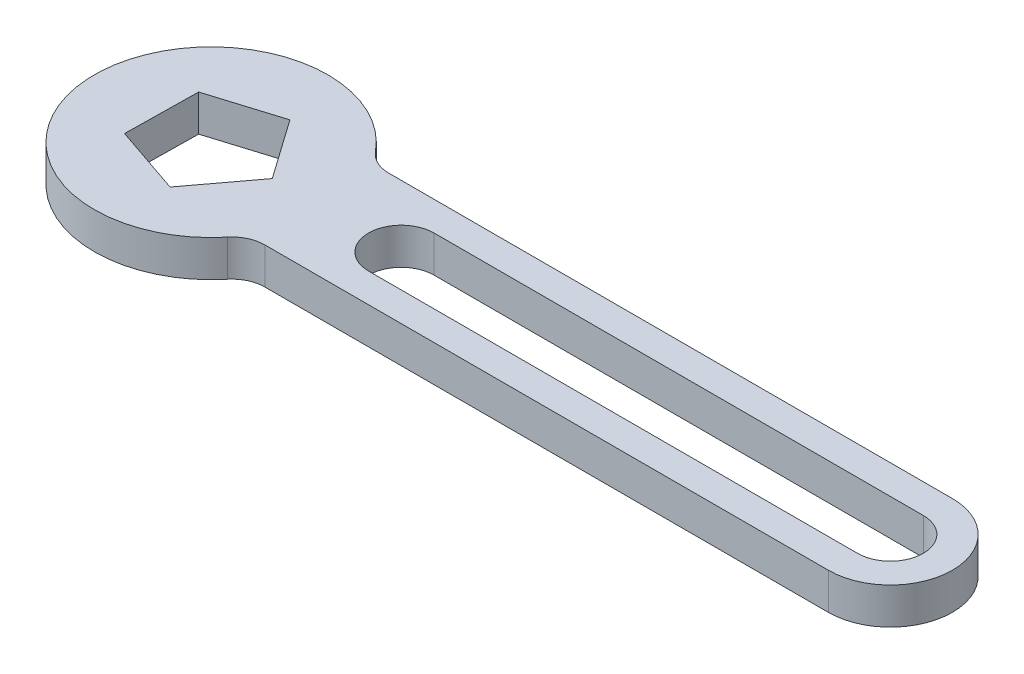
ISO-10303-21;
HEADER;
FILE_DESCRIPTION(('STEP AP214'),'2;1');
FILE_NAME('part.step','',(''),(''),'','','');
FILE_SCHEMA(('AUTOMOTIVE_DESIGN { 1 0 10303 214 1 1 1 1 }'));
ENDSEC;
DATA;
#1=APPLICATION_CONTEXT('core data for automotive mechanical design processes');
#2=APPLICATION_PROTOCOL_DEFINITION('international standard','automotive_design',2000,#1);
#3=PRODUCT_CONTEXT('',#1,'mechanical');
#4=PRODUCT('Part','Part','',(#3));
#5=PRODUCT_RELATED_PRODUCT_CATEGORY('part','',(#4));
#6=PRODUCT_DEFINITION_FORMATION('','',#4);
#7=PRODUCT_DEFINITION_CONTEXT('part definition',#1,'design');
#8=PRODUCT_DEFINITION('design','',#6,#7);
#9=PRODUCT_DEFINITION_SHAPE('','',#8);
#10=(LENGTH_UNIT() NAMED_UNIT(*) SI_UNIT(.MILLI.,.METRE.));
#11=(NAMED_UNIT(*) PLANE_ANGLE_UNIT() SI_UNIT($,.RADIAN.));
#12=(NAMED_UNIT(*) SI_UNIT($,.STERADIAN.) SOLID_ANGLE_UNIT());
#13=UNCERTAINTY_MEASURE_WITH_UNIT(LENGTH_MEASURE(1.E-05),#10,'distance_accuracy_value','');
#14=(GEOMETRIC_REPRESENTATION_CONTEXT(3) GLOBAL_UNCERTAINTY_ASSIGNED_CONTEXT((#13)) GLOBAL_UNIT_ASSIGNED_CONTEXT((#10,
#11,#12)) REPRESENTATION_CONTEXT('',''));
#15=CARTESIAN_POINT('',(0.,0.,0.));
#16=DIRECTION('',(0.,0.,1.));
#17=DIRECTION('',(1.,0.,0.));
#18=AXIS2_PLACEMENT_3D('',#15,#16,#17);
#19=CARTESIAN_POINT('',(-134.,10.,0.));
#20=DIRECTION('',(0.,-1.,0.));
#21=DIRECTION('',(0.,0.,-1.));
#22=AXIS2_PLACEMENT_3D('',#19,#20,#21);
#23=CYLINDRICAL_SURFACE('',#22,9.00000000000001);
#24=CARTESIAN_POINT('',(-134.,0.,0.));
#25=DIRECTION('',(0.,1.,0.));
#26=DIRECTION('',(0.,0.,1.));
#27=AXIS2_PLACEMENT_3D('',#24,#25,#26);
#28=CIRCLE('',#27,9.00000000000001);
#29=CARTESIAN_POINT('',(-134.,0.,-8.99999999999999));
#30=VERTEX_POINT('',#29);
#31=CARTESIAN_POINT('',(-134.,0.,9.00000000000002));
#32=VERTEX_POINT('',#31);
#33=EDGE_CURVE('E228',#30,#32,#28,.T.);
#34=ORIENTED_EDGE('',*,*,#33,.F.);
#35=DIRECTION('',(0.,-1.,0.));
#36=VECTOR('',#35,1.);
#37=CARTESIAN_POINT('',(-134.,10.,-8.99999999999999));
#38=LINE('',#37,#36);
#39=CARTESIAN_POINT('',(-134.,10.,-8.99999999999999));
#40=VERTEX_POINT('',#39);
#41=EDGE_CURVE('E11',#40,#30,#38,.T.);
#42=ORIENTED_EDGE('',*,*,#41,.F.);
#43=CARTESIAN_POINT('',(-134.,10.,0.));
#44=DIRECTION('',(0.,1.,0.));
#45=DIRECTION('',(0.,0.,1.));
#46=AXIS2_PLACEMENT_3D('',#43,#44,#45);
#47=CIRCLE('',#46,9.00000000000001);
#48=CARTESIAN_POINT('',(-134.,10.,9.00000000000002));
#49=VERTEX_POINT('',#48);
#50=EDGE_CURVE('E163',#40,#49,#47,.T.);
#51=ORIENTED_EDGE('',*,*,#50,.T.);
#52=DIRECTION('',(0.,-1.,0.));
#53=VECTOR('',#52,1.);
#54=CARTESIAN_POINT('',(-134.,10.,9.00000000000002));
#55=LINE('',#54,#53);
#56=EDGE_CURVE('E116',#49,#32,#55,.T.);
#57=ORIENTED_EDGE('',*,*,#56,.T.);
#58=EDGE_LOOP('',(#34,#42,#51,#57));
#59=FACE_BOUND('',#58,.T.);
#60=ADVANCED_FACE('F41',(#59),#23,.F.);
#61=CARTESIAN_POINT('',(0.,10.,-9.));
#62=DIRECTION('',(0.,0.,-1.));
#63=DIRECTION('',(-1.,0.,0.));
#64=AXIS2_PLACEMENT_3D('',#61,#62,#63);
#65=PLANE('',#64);
#66=DIRECTION('',(1.,0.,0.));
#67=VECTOR('',#66,1.);
#68=CARTESIAN_POINT('',(0.,0.,-9.));
#69=LINE('',#68,#67);
#70=CARTESIAN_POINT('',(0.,0.,-9.));
#71=VERTEX_POINT('',#70);
#72=EDGE_CURVE('E170',#30,#71,#69,.T.);
#73=ORIENTED_EDGE('',*,*,#72,.T.);
#74=DIRECTION('',(0.,-1.,0.));
#75=VECTOR('',#74,1.);
#76=CARTESIAN_POINT('',(0.,10.,-9.));
#77=LINE('',#76,#75);
#78=CARTESIAN_POINT('',(0.,10.,-9.));
#79=VERTEX_POINT('',#78);
#80=EDGE_CURVE('E52',#79,#71,#77,.T.);
#81=ORIENTED_EDGE('',*,*,#80,.F.);
#82=DIRECTION('',(1.,0.,0.));
#83=VECTOR('',#82,1.);
#84=CARTESIAN_POINT('',(0.,10.,-9.));
#85=LINE('',#84,#83);
#86=EDGE_CURVE('E158',#40,#79,#85,.T.);
#87=ORIENTED_EDGE('',*,*,#86,.F.);
#88=ORIENTED_EDGE('',*,*,#41,.T.);
#89=EDGE_LOOP('',(#73,#81,#87,#88));
#90=FACE_BOUND('',#89,.T.);
#91=ADVANCED_FACE('F168',(#90),#65,.F.);
#92=CARTESIAN_POINT('',(0.,10.,0.));
#93=DIRECTION('',(0.,-1.,0.));
#94=DIRECTION('',(0.,0.,-1.));
#95=AXIS2_PLACEMENT_3D('',#92,#93,#94);
#96=CYLINDRICAL_SURFACE('',#95,9.);
#97=CARTESIAN_POINT('',(0.,0.,0.));
#98=DIRECTION('',(0.,1.,0.));
#99=DIRECTION('',(0.,0.,1.));
#100=AXIS2_PLACEMENT_3D('',#97,#98,#99);
#101=CIRCLE('',#100,9.);
#102=CARTESIAN_POINT('',(0.,0.,9.));
#103=VERTEX_POINT('',#102);
#104=EDGE_CURVE('E234',#103,#71,#101,.T.);
#105=ORIENTED_EDGE('',*,*,#104,.F.);
#106=DIRECTION('',(0.,-1.,0.));
#107=VECTOR('',#106,1.);
#108=CARTESIAN_POINT('',(0.,10.,9.));
#109=LINE('',#108,#107);
#110=CARTESIAN_POINT('',(0.,10.,9.));
#111=VERTEX_POINT('',#110);
#112=EDGE_CURVE('E109',#111,#103,#109,.T.);
#113=ORIENTED_EDGE('',*,*,#112,.F.);
#114=CARTESIAN_POINT('',(0.,10.,0.));
#115=DIRECTION('',(0.,1.,0.));
#116=DIRECTION('',(0.,0.,1.));
#117=AXIS2_PLACEMENT_3D('',#114,#115,#116);
#118=CIRCLE('',#117,9.);
#119=EDGE_CURVE('E162',#111,#79,#118,.T.);
#120=ORIENTED_EDGE('',*,*,#119,.T.);
#121=ORIENTED_EDGE('',*,*,#80,.T.);
#122=EDGE_LOOP('',(#105,#113,#120,#121));
#123=FACE_BOUND('',#122,.T.);
#124=ADVANCED_FACE('F176',(#123),#96,.F.);
#125=CARTESIAN_POINT('',(-186.104281585721,10.,0.));
#126=DIRECTION('',(0.,-1.,0.));
#127=DIRECTION('',(0.,0.,-1.));
#128=AXIS2_PLACEMENT_3D('',#125,#126,#127);
#129=CYLINDRICAL_SURFACE('',#128,32.);
#130=CARTESIAN_POINT('',(-186.104281585721,0.,0.));
#131=DIRECTION('',(0.,1.,0.));
#132=DIRECTION('',(0.,0.,1.));
#133=AXIS2_PLACEMENT_3D('',#130,#131,#132);
#134=CIRCLE('',#133,32.);
#135=CARTESIAN_POINT('',(-161.361464049491,0.,-20.2926829268293));
#136=VERTEX_POINT('',#135);
#137=CARTESIAN_POINT('',(-161.361464049491,0.,20.2926829268293));
#138=VERTEX_POINT('',#137);
#139=EDGE_CURVE('E204',#136,#138,#134,.T.);
#140=ORIENTED_EDGE('',*,*,#139,.T.);
#141=DIRECTION('',(0.,-1.,0.));
#142=VECTOR('',#141,1.);
#143=CARTESIAN_POINT('',(-161.361464049491,10.,20.2926829268293));
#144=LINE('',#143,#142);
#145=CARTESIAN_POINT('',(-161.361464049491,10.,20.2926829268293));
#146=VERTEX_POINT('',#145);
#147=EDGE_CURVE('E243',#146,#138,#144,.T.);
#148=ORIENTED_EDGE('',*,*,#147,.F.);
#149=CARTESIAN_POINT('',(-186.104281585721,10.,0.));
#150=DIRECTION('',(0.,1.,0.));
#151=DIRECTION('',(0.,0.,1.));
#152=AXIS2_PLACEMENT_3D('',#149,#150,#151);
#153=CIRCLE('',#152,32.);
#154=CARTESIAN_POINT('',(-161.361464049491,10.,-20.2926829268293));
#155=VERTEX_POINT('',#154);
#156=EDGE_CURVE('E306',#155,#146,#153,.T.);
#157=ORIENTED_EDGE('',*,*,#156,.F.);
#158=DIRECTION('',(0.,-1.,0.));
#159=VECTOR('',#158,1.);
#160=CARTESIAN_POINT('',(-161.361464049491,10.,-20.2926829268293));
#161=LINE('',#160,#159);
#162=EDGE_CURVE('E246',#155,#136,#161,.T.);
#163=ORIENTED_EDGE('',*,*,#162,.T.);
#164=EDGE_LOOP('',(#140,#148,#157,#163));
#165=FACE_BOUND('',#164,.T.);
#166=ADVANCED_FACE('F371',(#165),#129,.T.);
#167=CARTESIAN_POINT('',(-154.402546617426,10.,26.));
#168=DIRECTION('',(0.,-1.,0.));
#169=DIRECTION('',(0.,0.,-1.));
#170=AXIS2_PLACEMENT_3D('',#167,#168,#169);
#171=CYLINDRICAL_SURFACE('',#170,9.00000000000001);
#172=CARTESIAN_POINT('',(-154.402546617426,0.,26.));
#173=DIRECTION('',(0.,1.,0.));
#174=DIRECTION('',(0.,0.,1.));
#175=AXIS2_PLACEMENT_3D('',#172,#173,#174);
#176=CIRCLE('',#175,9.00000000000001);
#177=CARTESIAN_POINT('',(-154.402546617426,0.,17.));
#178=VERTEX_POINT('',#177);
#179=EDGE_CURVE('E208',#138,#178,#176,.F.);
#180=ORIENTED_EDGE('',*,*,#179,.T.);
#181=DIRECTION('',(0.,-1.,0.));
#182=VECTOR('',#181,1.);
#183=CARTESIAN_POINT('',(-154.402546617426,10.,17.));
#184=LINE('',#183,#182);
#185=CARTESIAN_POINT('',(-154.402546617426,10.,17.));
#186=VERTEX_POINT('',#185);
#187=EDGE_CURVE('E258',#186,#178,#184,.T.);
#188=ORIENTED_EDGE('',*,*,#187,.F.);
#189=CARTESIAN_POINT('',(-154.402546617426,10.,26.));
#190=DIRECTION('',(0.,1.,0.));
#191=DIRECTION('',(0.,0.,1.));
#192=AXIS2_PLACEMENT_3D('',#189,#190,#191);
#193=CIRCLE('',#192,9.00000000000001);
#194=EDGE_CURVE('E313',#146,#186,#193,.F.);
#195=ORIENTED_EDGE('',*,*,#194,.F.);
#196=ORIENTED_EDGE('',*,*,#147,.T.);
#197=EDGE_LOOP('',(#180,#188,#195,#196));
#198=FACE_BOUND('',#197,.T.);
#199=ADVANCED_FACE('F367',(#198),#171,.F.);
#200=CARTESIAN_POINT('',(0.,10.,17.));
#201=DIRECTION('',(0.,0.,1.));
#202=DIRECTION('',(1.,0.,0.));
#203=AXIS2_PLACEMENT_3D('',#200,#201,#202);
#204=PLANE('',#203);
#205=DIRECTION('',(-1.,0.,0.));
#206=VECTOR('',#205,1.);
#207=CARTESIAN_POINT('',(0.,0.,17.));
#208=LINE('',#207,#206);
#209=CARTESIAN_POINT('',(0.,0.,17.));
#210=VERTEX_POINT('',#209);
#211=EDGE_CURVE('E212',#210,#178,#208,.T.);
#212=ORIENTED_EDGE('',*,*,#211,.F.);
#213=DIRECTION('',(0.,-1.,0.));
#214=VECTOR('',#213,1.);
#215=CARTESIAN_POINT('',(0.,10.,17.));
#216=LINE('',#215,#214);
#217=CARTESIAN_POINT('',(0.,10.,17.));
#218=VERTEX_POINT('',#217);
#219=EDGE_CURVE('E255',#218,#210,#216,.T.);
#220=ORIENTED_EDGE('',*,*,#219,.F.);
#221=DIRECTION('',(-1.,0.,0.));
#222=VECTOR('',#221,1.);
#223=CARTESIAN_POINT('',(0.,10.,17.));
#224=LINE('',#223,#222);
#225=EDGE_CURVE('E316',#218,#186,#224,.T.);
#226=ORIENTED_EDGE('',*,*,#225,.T.);
#227=ORIENTED_EDGE('',*,*,#187,.T.);
#228=EDGE_LOOP('',(#212,#220,#226,#227));
#229=FACE_BOUND('',#228,.T.);
#230=ADVANCED_FACE('F363',(#229),#204,.T.);
#231=CARTESIAN_POINT('',(0.,10.,0.));
#232=DIRECTION('',(0.,-1.,0.));
#233=DIRECTION('',(0.,0.,-1.));
#234=AXIS2_PLACEMENT_3D('',#231,#232,#233);
#235=CYLINDRICAL_SURFACE('',#234,17.);
#236=CARTESIAN_POINT('',(0.,0.,0.));
#237=DIRECTION('',(0.,1.,0.));
#238=DIRECTION('',(0.,0.,1.));
#239=AXIS2_PLACEMENT_3D('',#236,#237,#238);
#240=CIRCLE('',#239,17.);
#241=CARTESIAN_POINT('',(0.,0.,-17.));
#242=VERTEX_POINT('',#241);
#243=EDGE_CURVE('E216',#210,#242,#240,.T.);
#244=ORIENTED_EDGE('',*,*,#243,.T.);
#245=DIRECTION('',(0.,-1.,0.));
#246=VECTOR('',#245,1.);
#247=CARTESIAN_POINT('',(0.,10.,-17.));
#248=LINE('',#247,#246);
#249=CARTESIAN_POINT('',(0.,10.,-17.));
#250=VERTEX_POINT('',#249);
#251=EDGE_CURVE('E252',#250,#242,#248,.T.);
#252=ORIENTED_EDGE('',*,*,#251,.F.);
#253=CARTESIAN_POINT('',(0.,10.,0.));
#254=DIRECTION('',(0.,1.,0.));
#255=DIRECTION('',(0.,0.,1.));
#256=AXIS2_PLACEMENT_3D('',#253,#254,#255);
#257=CIRCLE('',#256,17.);
#258=EDGE_CURVE('E320',#218,#250,#257,.T.);
#259=ORIENTED_EDGE('',*,*,#258,.F.);
#260=ORIENTED_EDGE('',*,*,#219,.T.);
#261=EDGE_LOOP('',(#244,#252,#259,#260));
#262=FACE_BOUND('',#261,.T.);
#263=ADVANCED_FACE('F359',(#262),#235,.T.);
#264=CARTESIAN_POINT('',(0.,10.,-17.));
#265=DIRECTION('',(0.,0.,-1.));
#266=DIRECTION('',(-1.,0.,0.));
#267=AXIS2_PLACEMENT_3D('',#264,#265,#266);
#268=PLANE('',#267);
#269=DIRECTION('',(1.,0.,0.));
#270=VECTOR('',#269,1.);
#271=CARTESIAN_POINT('',(0.,0.,-17.));
#272=LINE('',#271,#270);
#273=CARTESIAN_POINT('',(-154.402546617426,0.,-17.));
#274=VERTEX_POINT('',#273);
#275=EDGE_CURVE('E220',#274,#242,#272,.T.);
#276=ORIENTED_EDGE('',*,*,#275,.F.);
#277=DIRECTION('',(0.,-1.,0.));
#278=VECTOR('',#277,1.);
#279=CARTESIAN_POINT('',(-154.402546617426,10.,-17.));
#280=LINE('',#279,#278);
#281=CARTESIAN_POINT('',(-154.402546617426,10.,-17.));
#282=VERTEX_POINT('',#281);
#283=EDGE_CURVE('E249',#282,#274,#280,.T.);
#284=ORIENTED_EDGE('',*,*,#283,.F.);
#285=DIRECTION('',(1.,0.,0.));
#286=VECTOR('',#285,1.);
#287=CARTESIAN_POINT('',(0.,10.,-17.));
#288=LINE('',#287,#286);
#289=EDGE_CURVE('E323',#282,#250,#288,.T.);
#290=ORIENTED_EDGE('',*,*,#289,.T.);
#291=ORIENTED_EDGE('',*,*,#251,.T.);
#292=EDGE_LOOP('',(#276,#284,#290,#291));
#293=FACE_BOUND('',#292,.T.);
#294=ADVANCED_FACE('F356',(#293),#268,.T.);
#295=CARTESIAN_POINT('',(-113.156289943218,10.,79.6846287363797));
#296=DIRECTION('',(-0.8176155015426,0.,0.575764614783891));
#297=DIRECTION('',(0.575764614783891,0.,0.8176155015426));
#298=AXIS2_PLACEMENT_3D('',#295,#296,#297);
#299=PLANE('',#298);
#300=DIRECTION('',(-0.575764614783891,0.,-0.8176155015426));
#301=VECTOR('',#300,1.);
#302=CARTESIAN_POINT('',(-113.156289943218,0.,79.6846287363797));
#303=LINE('',#302,#301);
#304=CARTESIAN_POINT('',(-169.09312349568,0.,0.251434953070062));
#305=VERTEX_POINT('',#304);
#306=CARTESIAN_POINT('',(-180.608415791358,0.,-16.1008750777819));
#307=VERTEX_POINT('',#306);
#308=EDGE_CURVE('E184',#305,#307,#303,.T.);
#309=ORIENTED_EDGE('',*,*,#308,.F.);
#310=DIRECTION('',(0.,-1.,0.));
#311=VECTOR('',#310,1.);
#312=CARTESIAN_POINT('',(-169.09312349568,10.,0.251434953070062));
#313=LINE('',#312,#311);
#314=CARTESIAN_POINT('',(-169.09312349568,10.,0.251434953070062));
#315=VERTEX_POINT('',#314);
#316=EDGE_CURVE('E45',#315,#305,#313,.T.);
#317=ORIENTED_EDGE('',*,*,#316,.F.);
#318=DIRECTION('',(-0.575764614783891,0.,-0.8176155015426));
#319=VECTOR('',#318,1.);
#320=CARTESIAN_POINT('',(-113.156289943218,10.,79.6846287363797));
#321=LINE('',#320,#319);
#322=CARTESIAN_POINT('',(-180.608415791358,10.,-16.1008750777819));
#323=VERTEX_POINT('',#322);
#324=EDGE_CURVE('E240',#315,#323,#321,.T.);
#325=ORIENTED_EDGE('',*,*,#324,.T.);
#326=DIRECTION('',(0.,-1.,0.));
#327=VECTOR('',#326,1.);
#328=CARTESIAN_POINT('',(-180.608415791358,10.,-16.1008750777819));
#329=LINE('',#328,#327);
#330=EDGE_CURVE('E180',#323,#307,#329,.T.);
#331=ORIENTED_EDGE('',*,*,#330,.T.);
#332=EDGE_LOOP('',(#309,#317,#325,#331));
#333=FACE_BOUND('',#332,.T.);
#334=ADVANCED_FACE('F43',(#333),#299,.T.);
#335=CARTESIAN_POINT('',(-108.164360160314,10.,-81.0551700919869));
#336=DIRECTION('',(-0.800241773583448,0.,-0.599677499838053));
#337=DIRECTION('',(-0.599677499838053,0.,0.800241773583448));
#338=AXIS2_PLACEMENT_3D('',#335,#336,#337);
#339=PLANE('',#338);
#340=DIRECTION('',(0.599677499838053,0.,-0.800241773583448));
#341=VECTOR('',#340,1.);
#342=CARTESIAN_POINT('',(-108.164360160314,0.,-81.0551700919869));
#343=LINE('',#342,#341);
#344=CARTESIAN_POINT('',(-181.086673492441,0.,16.256270424739));
#345=VERTEX_POINT('',#344);
#346=EDGE_CURVE('E188',#345,#305,#343,.T.);
#347=ORIENTED_EDGE('',*,*,#346,.F.);
#348=DIRECTION('',(0.,-1.,0.));
#349=VECTOR('',#348,1.);
#350=CARTESIAN_POINT('',(-181.086673492441,10.,16.256270424739));
#351=LINE('',#350,#349);
#352=CARTESIAN_POINT('',(-181.086673492441,10.,16.256270424739));
#353=VERTEX_POINT('',#352);
#354=EDGE_CURVE('E271',#353,#345,#351,.T.);
#355=ORIENTED_EDGE('',*,*,#354,.F.);
#356=DIRECTION('',(0.599677499838053,0.,-0.800241773583448));
#357=VECTOR('',#356,1.);
#358=CARTESIAN_POINT('',(-108.164360160314,10.,-81.0551700919869));
#359=LINE('',#358,#357);
#360=EDGE_CURVE('E282',#353,#315,#359,.T.);
#361=ORIENTED_EDGE('',*,*,#360,.T.);
#362=ORIENTED_EDGE('',*,*,#316,.T.);
#363=EDGE_LOOP('',(#347,#355,#361,#362));
#364=FACE_BOUND('',#363,.T.);
#365=ADVANCED_FACE('F280',(#364),#339,.T.);
#366=CARTESIAN_POINT('',(-23.8669977373426,10.,69.9215671250189));
#367=DIRECTION('',(0.323038886250532,0.,-0.946385691972367));
#368=DIRECTION('',(-0.946385691972367,0.,-0.323038886250532));
#369=AXIS2_PLACEMENT_3D('',#366,#367,#368);
#370=PLANE('',#369);
#371=DIRECTION('',(0.946385691972367,0.,0.323038886250532));
#372=VECTOR('',#371,1.);
#373=CARTESIAN_POINT('',(-23.8669977373426,0.,69.9215671250189));
#374=LINE('',#373,#372);
#375=CARTESIAN_POINT('',(-200.014387331888,0.,9.79549269972833));
#376=VERTEX_POINT('',#375);
#377=EDGE_CURVE('E192',#376,#345,#374,.T.);
#378=ORIENTED_EDGE('',*,*,#377,.F.);
#379=DIRECTION('',(0.,-1.,0.));
#380=VECTOR('',#379,1.);
#381=CARTESIAN_POINT('',(-200.014387331888,10.,9.79549269972833));
#382=LINE('',#381,#380);
#383=CARTESIAN_POINT('',(-200.014387331888,10.,9.79549269972833));
#384=VERTEX_POINT('',#383);
#385=EDGE_CURVE('E269',#384,#376,#382,.T.);
#386=ORIENTED_EDGE('',*,*,#385,.F.);
#387=DIRECTION('',(0.946385691972367,0.,0.323038886250532));
#388=VECTOR('',#387,1.);
#389=CARTESIAN_POINT('',(-23.8669977373426,10.,69.9215671250189));
#390=LINE('',#389,#388);
#391=EDGE_CURVE('E290',#384,#353,#390,.T.);
#392=ORIENTED_EDGE('',*,*,#391,.T.);
#393=ORIENTED_EDGE('',*,*,#354,.T.);
#394=EDGE_LOOP('',(#378,#386,#392,#393));
#395=FACE_BOUND('',#394,.T.);
#396=ADVANCED_FACE('F288',(#395),#370,.T.);
#397=CARTESIAN_POINT('',(-199.825949026566,10.,-2.95354542293541));
#398=DIRECTION('',(0.999890784974188,0.,0.0147789757325421));
#399=DIRECTION('',(0.0147789757325421,0.,-0.999890784974188));
#400=AXIS2_PLACEMENT_3D('',#397,#398,#399);
#401=PLANE('',#400);
#402=DIRECTION('',(-0.0147789757325421,0.,0.999890784974188));
#403=VECTOR('',#402,1.);
#404=CARTESIAN_POINT('',(-199.825949026566,0.,-2.95354542293541));
#405=LINE('',#404,#403);
#406=CARTESIAN_POINT('',(-199.718807817237,0.,-10.2023229997553));
#407=VERTEX_POINT('',#406);
#408=EDGE_CURVE('E196',#407,#376,#405,.T.);
#409=ORIENTED_EDGE('',*,*,#408,.F.);
#410=DIRECTION('',(0.,-1.,0.));
#411=VECTOR('',#410,1.);
#412=CARTESIAN_POINT('',(-199.718807817237,10.,-10.2023229997553));
#413=LINE('',#412,#411);
#414=CARTESIAN_POINT('',(-199.718807817237,10.,-10.2023229997553));
#415=VERTEX_POINT('',#414);
#416=EDGE_CURVE('E266',#415,#407,#413,.T.);
#417=ORIENTED_EDGE('',*,*,#416,.F.);
#418=DIRECTION('',(-0.0147789757325421,0.,0.999890784974188));
#419=VECTOR('',#418,1.);
#420=CARTESIAN_POINT('',(-199.825949026566,10.,-2.95354542293541));
#421=LINE('',#420,#419);
#422=EDGE_CURVE('E297',#415,#384,#421,.T.);
#423=ORIENTED_EDGE('',*,*,#422,.T.);
#424=ORIENTED_EDGE('',*,*,#385,.T.);
#425=EDGE_LOOP('',(#409,#417,#423,#424));
#426=FACE_BOUND('',#425,.T.);
#427=ADVANCED_FACE('F301',(#426),#401,.T.);
#428=CARTESIAN_POINT('',(-154.402546617426,10.,-26.));
#429=DIRECTION('',(0.,-1.,0.));
#430=DIRECTION('',(0.,0.,-1.));
#431=AXIS2_PLACEMENT_3D('',#428,#429,#430);
#432=CYLINDRICAL_SURFACE('',#431,9.00000000000002);
#433=CARTESIAN_POINT('',(-154.402546617426,0.,-26.));
#434=DIRECTION('',(0.,1.,0.));
#435=DIRECTION('',(0.,0.,1.));
#436=AXIS2_PLACEMENT_3D('',#433,#434,#435);
#437=CIRCLE('',#436,9.00000000000002);
#438=EDGE_CURVE('E224',#136,#274,#437,.T.);
#439=ORIENTED_EDGE('',*,*,#438,.F.);
#440=ORIENTED_EDGE('',*,*,#162,.F.);
#441=CARTESIAN_POINT('',(-154.402546617426,10.,-26.));
#442=DIRECTION('',(0.,1.,0.));
#443=DIRECTION('',(0.,0.,1.));
#444=AXIS2_PLACEMENT_3D('',#441,#442,#443);
#445=CIRCLE('',#444,9.00000000000002);
#446=EDGE_CURVE('E327',#155,#282,#445,.T.);
#447=ORIENTED_EDGE('',*,*,#446,.T.);
#448=ORIENTED_EDGE('',*,*,#283,.T.);
#449=EDGE_LOOP('',(#439,#440,#447,#448));
#450=FACE_BOUND('',#449,.T.);
#451=ADVANCED_FACE('F341',(#450),#432,.F.);
#452=CARTESIAN_POINT('',(-20.2471070968625,10.,-65.5974803464763));
#453=DIRECTION('',(0.294927603901329,0.,0.955519601293988));
#454=DIRECTION('',(0.955519601293988,0.,-0.294927603901329));
#455=AXIS2_PLACEMENT_3D('',#452,#453,#454);
#456=PLANE('',#455);
#457=DIRECTION('',(-0.955519601293988,0.,0.294927603901329));
#458=VECTOR('',#457,1.);
#459=CARTESIAN_POINT('',(-20.2471070968625,0.,-65.5974803464763));
#460=LINE('',#459,#458);
#461=EDGE_CURVE('E200',#307,#407,#460,.T.);
#462=ORIENTED_EDGE('',*,*,#461,.F.);
#463=ORIENTED_EDGE('',*,*,#330,.F.);
#464=DIRECTION('',(-0.955519601293988,0.,0.294927603901329));
#465=VECTOR('',#464,1.);
#466=CARTESIAN_POINT('',(-20.2471070968625,10.,-65.5974803464763));
#467=LINE('',#466,#465);
#468=EDGE_CURVE('E303',#323,#415,#467,.T.);
#469=ORIENTED_EDGE('',*,*,#468,.T.);
#470=ORIENTED_EDGE('',*,*,#416,.T.);
#471=EDGE_LOOP('',(#462,#463,#469,#470));
#472=FACE_BOUND('',#471,.T.);
#473=ADVANCED_FACE('F334',(#472),#456,.T.);
#474=CARTESIAN_POINT('',(0.,10.,9.));
#475=DIRECTION('',(0.,0.,1.));
#476=DIRECTION('',(1.,0.,0.));
#477=AXIS2_PLACEMENT_3D('',#474,#475,#476);
#478=PLANE('',#477);
#479=DIRECTION('',(-1.,0.,0.));
#480=VECTOR('',#479,1.);
#481=CARTESIAN_POINT('',(0.,0.,9.));
#482=LINE('',#481,#480);
#483=EDGE_CURVE('E237',#103,#32,#482,.T.);
#484=ORIENTED_EDGE('',*,*,#483,.T.);
#485=ORIENTED_EDGE('',*,*,#56,.F.);
#486=DIRECTION('',(-1.,0.,0.));
#487=VECTOR('',#486,1.);
#488=CARTESIAN_POINT('',(0.,10.,9.));
#489=LINE('',#488,#487);
#490=EDGE_CURVE('E61',#111,#49,#489,.T.);
#491=ORIENTED_EDGE('',*,*,#490,.F.);
#492=ORIENTED_EDGE('',*,*,#112,.T.);
#493=EDGE_LOOP('',(#484,#485,#491,#492));
#494=FACE_BOUND('',#493,.T.);
#495=ADVANCED_FACE('F332',(#494),#478,.F.);
#496=CARTESIAN_POINT('',(0.,10.,0.));
#497=DIRECTION('',(0.,1.,0.));
#498=DIRECTION('',(0.,0.,1.));
#499=AXIS2_PLACEMENT_3D('',#496,#497,#498);
#500=PLANE('',#499);
#501=ORIENTED_EDGE('',*,*,#324,.F.);
#502=ORIENTED_EDGE('',*,*,#360,.F.);
#503=ORIENTED_EDGE('',*,*,#391,.F.);
#504=ORIENTED_EDGE('',*,*,#422,.F.);
#505=ORIENTED_EDGE('',*,*,#468,.F.);
#506=EDGE_LOOP('',(#501,#502,#503,#504,#505));
#507=FACE_BOUND('',#506,.T.);
#508=ORIENTED_EDGE('',*,*,#156,.T.);
#509=ORIENTED_EDGE('',*,*,#194,.T.);
#510=ORIENTED_EDGE('',*,*,#225,.F.);
#511=ORIENTED_EDGE('',*,*,#258,.T.);
#512=ORIENTED_EDGE('',*,*,#289,.F.);
#513=ORIENTED_EDGE('',*,*,#446,.F.);
#514=EDGE_LOOP('',(#508,#509,#510,#511,#512,#513));
#515=FACE_BOUND('',#514,.T.);
#516=ORIENTED_EDGE('',*,*,#50,.F.);
#517=ORIENTED_EDGE('',*,*,#86,.T.);
#518=ORIENTED_EDGE('',*,*,#119,.F.);
#519=ORIENTED_EDGE('',*,*,#490,.T.);
#520=EDGE_LOOP('',(#516,#517,#518,#519));
#521=FACE_BOUND('',#520,.T.);
#522=ADVANCED_FACE('F160',(#507,#515,#521),#500,.T.);
#523=CARTESIAN_POINT('',(0.,0.,0.));
#524=DIRECTION('',(0.,1.,0.));
#525=DIRECTION('',(0.,0.,1.));
#526=AXIS2_PLACEMENT_3D('',#523,#524,#525);
#527=PLANE('',#526);
#528=ORIENTED_EDGE('',*,*,#308,.T.);
#529=ORIENTED_EDGE('',*,*,#461,.T.);
#530=ORIENTED_EDGE('',*,*,#408,.T.);
#531=ORIENTED_EDGE('',*,*,#377,.T.);
#532=ORIENTED_EDGE('',*,*,#346,.T.);
#533=EDGE_LOOP('',(#528,#529,#530,#531,#532));
#534=FACE_BOUND('',#533,.T.);
#535=ORIENTED_EDGE('',*,*,#139,.F.);
#536=ORIENTED_EDGE('',*,*,#438,.T.);
#537=ORIENTED_EDGE('',*,*,#275,.T.);
#538=ORIENTED_EDGE('',*,*,#243,.F.);
#539=ORIENTED_EDGE('',*,*,#211,.T.);
#540=ORIENTED_EDGE('',*,*,#179,.F.);
#541=EDGE_LOOP('',(#535,#536,#537,#538,#539,#540));
#542=FACE_BOUND('',#541,.T.);
#543=ORIENTED_EDGE('',*,*,#33,.T.);
#544=ORIENTED_EDGE('',*,*,#483,.F.);
#545=ORIENTED_EDGE('',*,*,#104,.T.);
#546=ORIENTED_EDGE('',*,*,#72,.F.);
#547=EDGE_LOOP('',(#543,#544,#545,#546));
#548=FACE_BOUND('',#547,.T.);
#549=ADVANCED_FACE('F285',(#534,#542,#548),#527,.F.);
#550=CLOSED_SHELL('',(#60,#91,#124,#166,#199,#230,#263,#294,#334,#365,#396,#427,#451,#473,#495,
#522,#549));
#551=MANIFOLD_SOLID_BREP('B2',#550);
#552=ADVANCED_BREP_SHAPE_REPRESENTATION('',(#18,#551),#14);
#553=SHAPE_DEFINITION_REPRESENTATION(#9,#552);
ENDSEC;
END-ISO-10303-21;
